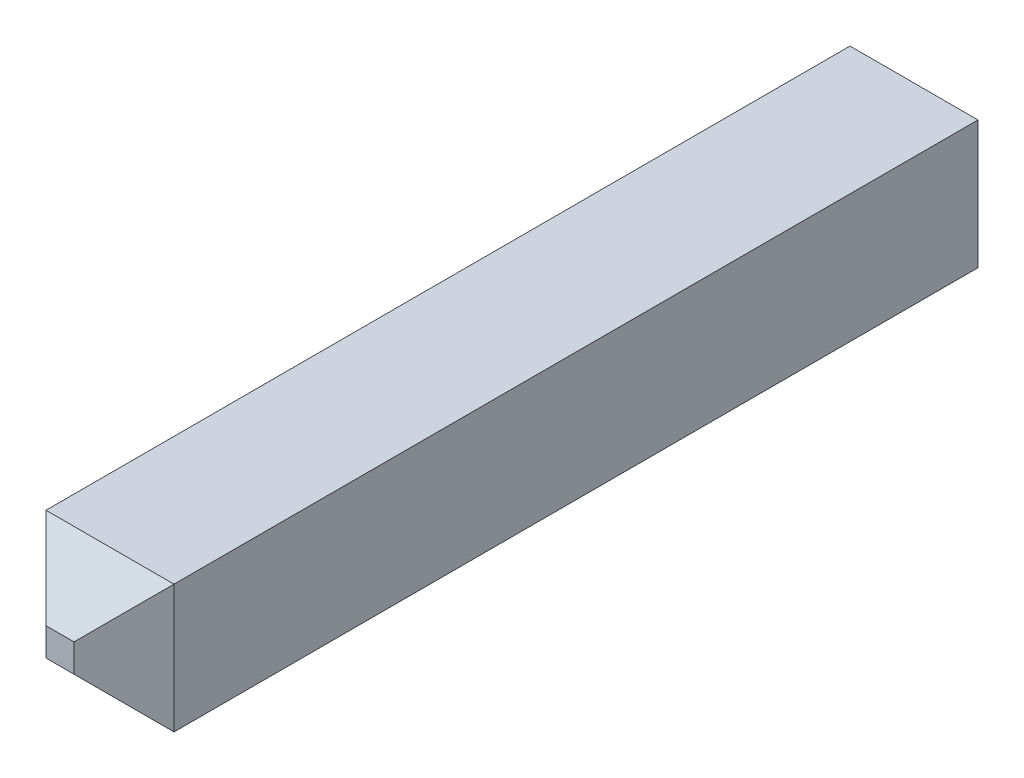
ISO-10303-21;
HEADER;
FILE_DESCRIPTION(('STEP AP214'),'2;1');
FILE_NAME('part.step','',(''),(''),'','','');
FILE_SCHEMA(('AUTOMOTIVE_DESIGN { 1 0 10303 214 1 1 1 1 }'));
ENDSEC;
DATA;
#1=APPLICATION_CONTEXT('core data for automotive mechanical design processes');
#2=APPLICATION_PROTOCOL_DEFINITION('international standard','automotive_design',2000,#1);
#3=PRODUCT_CONTEXT('',#1,'mechanical');
#4=PRODUCT('Part','Part','',(#3));
#5=PRODUCT_RELATED_PRODUCT_CATEGORY('part','',(#4));
#6=PRODUCT_DEFINITION_FORMATION('','',#4);
#7=PRODUCT_DEFINITION_CONTEXT('part definition',#1,'design');
#8=PRODUCT_DEFINITION('design','',#6,#7);
#9=PRODUCT_DEFINITION_SHAPE('','',#8);
#10=(LENGTH_UNIT() NAMED_UNIT(*) SI_UNIT(.MILLI.,.METRE.));
#11=(NAMED_UNIT(*) PLANE_ANGLE_UNIT() SI_UNIT($,.RADIAN.));
#12=(NAMED_UNIT(*) SI_UNIT($,.STERADIAN.) SOLID_ANGLE_UNIT());
#13=UNCERTAINTY_MEASURE_WITH_UNIT(LENGTH_MEASURE(1.E-05),#10,'distance_accuracy_value','');
#14=(GEOMETRIC_REPRESENTATION_CONTEXT(3) GLOBAL_UNCERTAINTY_ASSIGNED_CONTEXT((#13)) GLOBAL_UNIT_ASSIGNED_CONTEXT((#10,
#11,#12)) REPRESENTATION_CONTEXT('',''));
#15=CARTESIAN_POINT('',(0.,0.,0.));
#16=DIRECTION('',(0.,0.,1.));
#17=DIRECTION('',(1.,0.,0.));
#18=AXIS2_PLACEMENT_3D('',#15,#16,#17);
#19=CARTESIAN_POINT('',(4.05,-13.01,-7.36));
#20=DIRECTION('',(0.70710678118655,0.,-0.707106781186545));
#21=DIRECTION('',(-0.707106781186545,0.,-0.70710678118655));
#22=AXIS2_PLACEMENT_3D('',#19,#20,#21);
#23=PLANE('',#22);
#24=DIRECTION('',(0.,1.,0.));
#25=VECTOR('',#24,1.);
#26=CARTESIAN_POINT('',(3.8,-12.69,-7.61));
#27=LINE('',#26,#25);
#28=CARTESIAN_POINT('',(3.8,-13.33,-7.61));
#29=VERTEX_POINT('',#28);
#30=CARTESIAN_POINT('',(3.8,-12.69,-7.61));
#31=VERTEX_POINT('',#30);
#32=EDGE_CURVE('E91',#29,#31,#27,.T.);
#33=ORIENTED_EDGE('',*,*,#32,.F.);
#34=DIRECTION('',(0.577350269189626,0.577350269189623,0.577350269189629));
#35=VECTOR('',#34,1.);
#36=CARTESIAN_POINT('',(3.8,-13.33,-7.61));
#37=LINE('',#36,#35);
#38=CARTESIAN_POINT('',(4.05,-13.08,-7.36));
#39=VERTEX_POINT('',#38);
#40=EDGE_CURVE('E72',#29,#39,#37,.T.);
#41=ORIENTED_EDGE('',*,*,#40,.T.);
#42=DIRECTION('',(0.,1.,0.));
#43=VECTOR('',#42,1.);
#44=CARTESIAN_POINT('',(4.05,-13.01,-7.36));
#45=LINE('',#44,#43);
#46=CARTESIAN_POINT('',(4.05,-12.94,-7.36));
#47=VERTEX_POINT('',#46);
#48=EDGE_CURVE('E19',#47,#39,#45,.F.);
#49=ORIENTED_EDGE('',*,*,#48,.F.);
#50=DIRECTION('',(-0.577350269189624,0.577350269189625,-0.577350269189629));
#51=VECTOR('',#50,1.);
#52=CARTESIAN_POINT('',(4.05,-12.94,-7.36));
#53=LINE('',#52,#51);
#54=EDGE_CURVE('E70',#47,#31,#53,.T.);
#55=ORIENTED_EDGE('',*,*,#54,.T.);
#56=EDGE_LOOP('',(#33,#41,#49,#55));
#57=FACE_BOUND('',#56,.T.);
#58=ADVANCED_FACE('F16',(#57),#23,.F.);
#59=CARTESIAN_POINT('',(4.11999999999999,-13.01,-7.36));
#60=DIRECTION('',(0.,0.,1.));
#61=DIRECTION('',(1.,0.,0.));
#62=AXIS2_PLACEMENT_3D('',#59,#60,#61);
#63=PLANE('',#62);
#64=DIRECTION('',(0.,1.,0.));
#65=VECTOR('',#64,1.);
#66=CARTESIAN_POINT('',(4.19,-13.01,-7.36));
#67=LINE('',#66,#65);
#68=CARTESIAN_POINT('',(4.19,-13.08,-7.36));
#69=VERTEX_POINT('',#68);
#70=CARTESIAN_POINT('',(4.19,-12.94,-7.36));
#71=VERTEX_POINT('',#70);
#72=EDGE_CURVE('E78',#69,#71,#67,.T.);
#73=ORIENTED_EDGE('',*,*,#72,.T.);
#74=DIRECTION('',(1.,0.,0.));
#75=VECTOR('',#74,1.);
#76=CARTESIAN_POINT('',(4.11999999999999,-12.94,-7.36));
#77=LINE('',#76,#75);
#78=EDGE_CURVE('E74',#71,#47,#77,.F.);
#79=ORIENTED_EDGE('',*,*,#78,.T.);
#80=ORIENTED_EDGE('',*,*,#48,.T.);
#81=DIRECTION('',(1.,0.,0.));
#82=VECTOR('',#81,1.);
#83=CARTESIAN_POINT('',(4.11999999999999,-13.08,-7.36));
#84=LINE('',#83,#82);
#85=EDGE_CURVE('E86',#39,#69,#84,.T.);
#86=ORIENTED_EDGE('',*,*,#85,.T.);
#87=EDGE_LOOP('',(#73,#79,#80,#86));
#88=FACE_BOUND('',#87,.T.);
#89=ADVANCED_FACE('F76',(#88),#63,.T.);
#90=CARTESIAN_POINT('',(4.11999999999999,-12.94,-7.36));
#91=DIRECTION('',(0.,-0.70710678118655,-0.707106781186545));
#92=DIRECTION('',(0.,0.707106781186545,-0.70710678118655));
#93=AXIS2_PLACEMENT_3D('',#90,#91,#92);
#94=PLANE('',#93);
#95=DIRECTION('',(1.,0.,0.));
#96=VECTOR('',#95,1.);
#97=CARTESIAN_POINT('',(3.8,-12.69,-7.61));
#98=LINE('',#97,#96);
#99=CARTESIAN_POINT('',(4.44,-12.69,-7.61));
#100=VERTEX_POINT('',#99);
#101=EDGE_CURVE('E84',#31,#100,#98,.T.);
#102=ORIENTED_EDGE('',*,*,#101,.F.);
#103=ORIENTED_EDGE('',*,*,#54,.F.);
#104=ORIENTED_EDGE('',*,*,#78,.F.);
#105=DIRECTION('',(0.577350269189624,0.577350269189624,-0.577350269189628));
#106=VECTOR('',#105,1.);
#107=CARTESIAN_POINT('',(4.19,-12.94,-7.36));
#108=LINE('',#107,#106);
#109=EDGE_CURVE('E104',#71,#100,#108,.T.);
#110=ORIENTED_EDGE('',*,*,#109,.T.);
#111=EDGE_LOOP('',(#102,#103,#104,#110));
#112=FACE_BOUND('',#111,.T.);
#113=ADVANCED_FACE('F82',(#112),#94,.F.);
#114=CARTESIAN_POINT('',(4.11999999999999,-13.08,-7.36));
#115=DIRECTION('',(0.,0.70710678118655,-0.707106781186545));
#116=DIRECTION('',(0.,0.707106781186545,0.70710678118655));
#117=AXIS2_PLACEMENT_3D('',#114,#115,#116);
#118=PLANE('',#117);
#119=DIRECTION('',(1.,0.,0.));
#120=VECTOR('',#119,1.);
#121=CARTESIAN_POINT('',(3.8,-13.33,-7.61));
#122=LINE('',#121,#120);
#123=CARTESIAN_POINT('',(4.44,-13.33,-7.61));
#124=VERTEX_POINT('',#123);
#125=EDGE_CURVE('E34',#124,#29,#122,.F.);
#126=ORIENTED_EDGE('',*,*,#125,.F.);
#127=DIRECTION('',(-0.577350269189626,0.577350269189622,0.57735026918963));
#128=VECTOR('',#127,1.);
#129=CARTESIAN_POINT('',(4.44,-13.33,-7.61));
#130=LINE('',#129,#128);
#131=EDGE_CURVE('E101',#124,#69,#130,.T.);
#132=ORIENTED_EDGE('',*,*,#131,.T.);
#133=ORIENTED_EDGE('',*,*,#85,.F.);
#134=ORIENTED_EDGE('',*,*,#40,.F.);
#135=EDGE_LOOP('',(#126,#132,#133,#134));
#136=FACE_BOUND('',#135,.T.);
#137=ADVANCED_FACE('F138',(#136),#118,.F.);
#138=CARTESIAN_POINT('',(3.8,-12.69,-19.552));
#139=DIRECTION('',(-1.,0.,0.));
#140=DIRECTION('',(0.,0.,1.));
#141=AXIS2_PLACEMENT_3D('',#138,#139,#140);
#142=PLANE('',#141);
#143=ORIENTED_EDGE('',*,*,#32,.T.);
#144=DIRECTION('',(0.,0.,1.));
#145=VECTOR('',#144,1.);
#146=CARTESIAN_POINT('',(3.8,-12.69,-19.552));
#147=LINE('',#146,#145);
#148=CARTESIAN_POINT('',(3.8,-12.69,-11.63));
#149=VERTEX_POINT('',#148);
#150=EDGE_CURVE('E98',#149,#31,#147,.T.);
#151=ORIENTED_EDGE('',*,*,#150,.F.);
#152=DIRECTION('',(0.,1.,0.));
#153=VECTOR('',#152,1.);
#154=CARTESIAN_POINT('',(3.8,-12.69,-11.63));
#155=LINE('',#154,#153);
#156=CARTESIAN_POINT('',(3.8,-13.33,-11.63));
#157=VERTEX_POINT('',#156);
#158=EDGE_CURVE('E93',#149,#157,#155,.F.);
#159=ORIENTED_EDGE('',*,*,#158,.T.);
#160=DIRECTION('',(0.,0.,-1.));
#161=VECTOR('',#160,1.);
#162=CARTESIAN_POINT('',(3.8,-13.33,-19.552));
#163=LINE('',#162,#161);
#164=EDGE_CURVE('E110',#29,#157,#163,.T.);
#165=ORIENTED_EDGE('',*,*,#164,.F.);
#166=EDGE_LOOP('',(#143,#151,#159,#165));
#167=FACE_BOUND('',#166,.T.);
#168=ADVANCED_FACE('F137',(#167),#142,.T.);
#169=CARTESIAN_POINT('',(3.18683868012564,-12.69,-11.63));
#170=DIRECTION('',(0.,0.,1.));
#171=DIRECTION('',(1.,0.,0.));
#172=AXIS2_PLACEMENT_3D('',#169,#170,#171);
#173=PLANE('',#172);
#174=DIRECTION('',(1.,0.,0.));
#175=VECTOR('',#174,1.);
#176=CARTESIAN_POINT('',(3.8,-13.33,-11.63));
#177=LINE('',#176,#175);
#178=CARTESIAN_POINT('',(4.44,-13.33,-11.63));
#179=VERTEX_POINT('',#178);
#180=EDGE_CURVE('E106',#157,#179,#177,.T.);
#181=ORIENTED_EDGE('',*,*,#180,.F.);
#182=ORIENTED_EDGE('',*,*,#158,.F.);
#183=DIRECTION('',(1.,0.,0.));
#184=VECTOR('',#183,1.);
#185=CARTESIAN_POINT('',(3.8,-12.69,-11.63));
#186=LINE('',#185,#184);
#187=CARTESIAN_POINT('',(4.44,-12.69,-11.63));
#188=VERTEX_POINT('',#187);
#189=EDGE_CURVE('E95',#188,#149,#186,.F.);
#190=ORIENTED_EDGE('',*,*,#189,.F.);
#191=DIRECTION('',(0.,1.,0.));
#192=VECTOR('',#191,1.);
#193=CARTESIAN_POINT('',(4.44,-12.69,-11.63));
#194=LINE('',#193,#192);
#195=EDGE_CURVE('E113',#179,#188,#194,.T.);
#196=ORIENTED_EDGE('',*,*,#195,.F.);
#197=EDGE_LOOP('',(#181,#182,#190,#196));
#198=FACE_BOUND('',#197,.T.);
#199=ADVANCED_FACE('F132',(#198),#173,.F.);
#200=CARTESIAN_POINT('',(3.8,-12.69,-19.552));
#201=DIRECTION('',(0.,1.,0.));
#202=DIRECTION('',(0.,0.,1.));
#203=AXIS2_PLACEMENT_3D('',#200,#201,#202);
#204=PLANE('',#203);
#205=ORIENTED_EDGE('',*,*,#101,.T.);
#206=DIRECTION('',(0.,0.,-1.));
#207=VECTOR('',#206,1.);
#208=CARTESIAN_POINT('',(4.44,-12.69,-19.552));
#209=LINE('',#208,#207);
#210=EDGE_CURVE('E116',#188,#100,#209,.F.);
#211=ORIENTED_EDGE('',*,*,#210,.F.);
#212=ORIENTED_EDGE('',*,*,#189,.T.);
#213=ORIENTED_EDGE('',*,*,#150,.T.);
#214=EDGE_LOOP('',(#205,#211,#212,#213));
#215=FACE_BOUND('',#214,.T.);
#216=ADVANCED_FACE('F135',(#215),#204,.T.);
#217=CARTESIAN_POINT('',(4.19,-13.01,-7.36));
#218=DIRECTION('',(-0.70710678118655,0.,-0.707106781186545));
#219=DIRECTION('',(-0.707106781186545,0.,0.70710678118655));
#220=AXIS2_PLACEMENT_3D('',#217,#218,#219);
#221=PLANE('',#220);
#222=ORIENTED_EDGE('',*,*,#72,.F.);
#223=ORIENTED_EDGE('',*,*,#131,.F.);
#224=DIRECTION('',(0.,1.,0.));
#225=VECTOR('',#224,1.);
#226=CARTESIAN_POINT('',(4.44,-12.69,-7.61));
#227=LINE('',#226,#225);
#228=EDGE_CURVE('E25',#100,#124,#227,.F.);
#229=ORIENTED_EDGE('',*,*,#228,.F.);
#230=ORIENTED_EDGE('',*,*,#109,.F.);
#231=EDGE_LOOP('',(#222,#223,#229,#230));
#232=FACE_BOUND('',#231,.T.);
#233=ADVANCED_FACE('F126',(#232),#221,.F.);
#234=CARTESIAN_POINT('',(3.8,-13.33,-19.552));
#235=DIRECTION('',(0.,-1.,0.));
#236=DIRECTION('',(0.,0.,-1.));
#237=AXIS2_PLACEMENT_3D('',#234,#235,#236);
#238=PLANE('',#237);
#239=ORIENTED_EDGE('',*,*,#125,.T.);
#240=ORIENTED_EDGE('',*,*,#164,.T.);
#241=ORIENTED_EDGE('',*,*,#180,.T.);
#242=DIRECTION('',(0.,0.,-1.));
#243=VECTOR('',#242,1.);
#244=CARTESIAN_POINT('',(4.44,-13.33,-19.552));
#245=LINE('',#244,#243);
#246=EDGE_CURVE('E11',#124,#179,#245,.T.);
#247=ORIENTED_EDGE('',*,*,#246,.F.);
#248=EDGE_LOOP('',(#239,#240,#241,#247));
#249=FACE_BOUND('',#248,.T.);
#250=ADVANCED_FACE('F128',(#249),#238,.T.);
#251=CARTESIAN_POINT('',(4.44,-12.69,-19.552));
#252=DIRECTION('',(1.,0.,0.));
#253=DIRECTION('',(0.,0.,-1.));
#254=AXIS2_PLACEMENT_3D('',#251,#252,#253);
#255=PLANE('',#254);
#256=ORIENTED_EDGE('',*,*,#228,.T.);
#257=ORIENTED_EDGE('',*,*,#246,.T.);
#258=ORIENTED_EDGE('',*,*,#195,.T.);
#259=ORIENTED_EDGE('',*,*,#210,.T.);
#260=EDGE_LOOP('',(#256,#257,#258,#259));
#261=FACE_BOUND('',#260,.T.);
#262=ADVANCED_FACE('F122',(#261),#255,.T.);
#263=CLOSED_SHELL('',(#58,#89,#113,#137,#168,#199,#216,#233,#250,#262));
#264=MANIFOLD_SOLID_BREP('B1',#263);
#265=ADVANCED_BREP_SHAPE_REPRESENTATION('',(#18,#264),#14);
#266=SHAPE_DEFINITION_REPRESENTATION(#9,#265);
ENDSEC;
END-ISO-10303-21;
